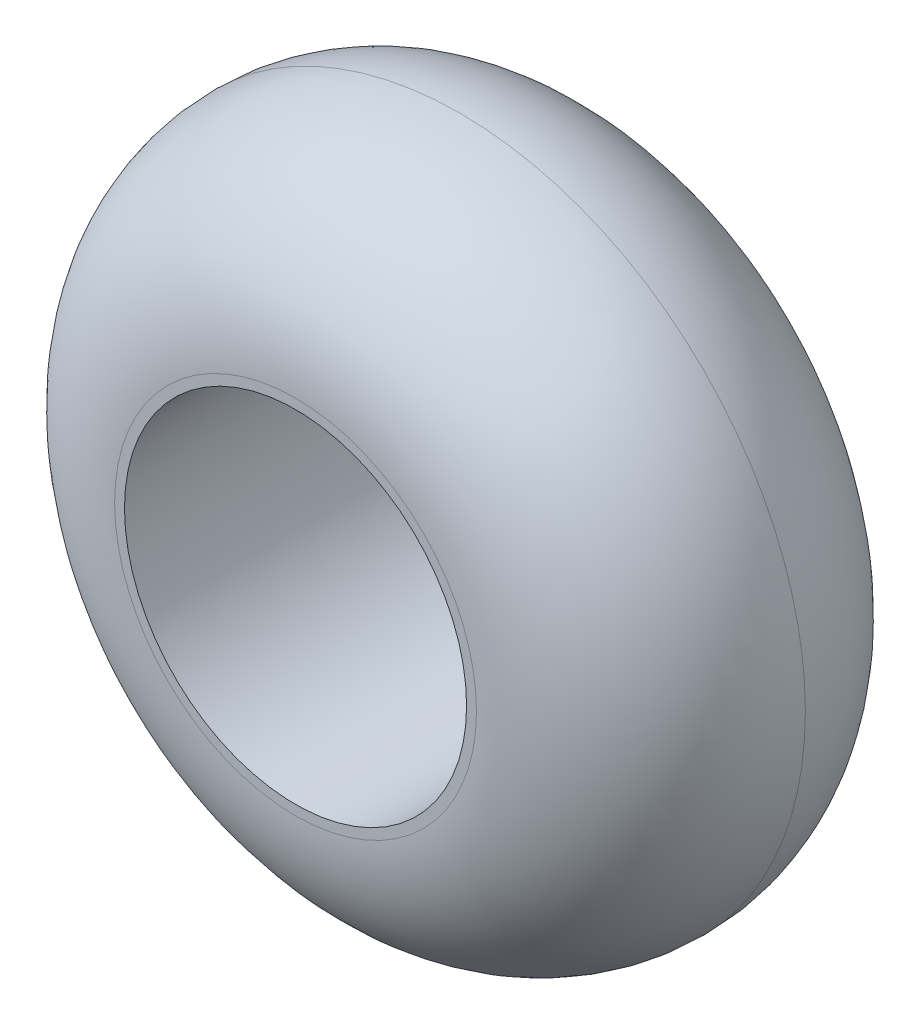
ISO-10303-21;
HEADER;
FILE_DESCRIPTION(('STEP AP214'),'2;1');
FILE_NAME('part.step','',(''),(''),'','','');
FILE_SCHEMA(('AUTOMOTIVE_DESIGN { 1 0 10303 214 1 1 1 1 }'));
ENDSEC;
DATA;
#1=APPLICATION_CONTEXT('core data for automotive mechanical design processes');
#2=APPLICATION_PROTOCOL_DEFINITION('international standard','automotive_design',2000,#1);
#3=PRODUCT_CONTEXT('',#1,'mechanical');
#4=PRODUCT('Part','Part','',(#3));
#5=PRODUCT_RELATED_PRODUCT_CATEGORY('part','',(#4));
#6=PRODUCT_DEFINITION_FORMATION('','',#4);
#7=PRODUCT_DEFINITION_CONTEXT('part definition',#1,'design');
#8=PRODUCT_DEFINITION('design','',#6,#7);
#9=PRODUCT_DEFINITION_SHAPE('','',#8);
#10=(LENGTH_UNIT() NAMED_UNIT(*) SI_UNIT(.MILLI.,.METRE.));
#11=(NAMED_UNIT(*) PLANE_ANGLE_UNIT() SI_UNIT($,.RADIAN.));
#12=(NAMED_UNIT(*) SI_UNIT($,.STERADIAN.) SOLID_ANGLE_UNIT());
#13=UNCERTAINTY_MEASURE_WITH_UNIT(LENGTH_MEASURE(1.E-05),#10,'distance_accuracy_value','');
#14=(GEOMETRIC_REPRESENTATION_CONTEXT(3) GLOBAL_UNCERTAINTY_ASSIGNED_CONTEXT((#13)) GLOBAL_UNIT_ASSIGNED_CONTEXT((#10,
#11,#12)) REPRESENTATION_CONTEXT('',''));
#15=CARTESIAN_POINT('',(0.,0.,0.));
#16=DIRECTION('',(0.,0.,1.));
#17=DIRECTION('',(1.,0.,0.));
#18=AXIS2_PLACEMENT_3D('',#15,#16,#17);
#19=CARTESIAN_POINT('',(0.,0.,5.));
#20=DIRECTION('',(0.,0.,1.));
#21=DIRECTION('',(1.,0.,0.));
#22=AXIS2_PLACEMENT_3D('',#19,#20,#21);
#23=PLANE('',#22);
#24=CARTESIAN_POINT('',(0.,0.,5.));
#25=DIRECTION('',(0.,0.,1.));
#26=DIRECTION('',(1.,0.,0.));
#27=AXIS2_PLACEMENT_3D('',#24,#25,#26);
#28=CIRCLE('',#27,2.75);
#29=CARTESIAN_POINT('',(2.75,0.,5.));
#30=VERTEX_POINT('',#29);
#31=EDGE_CURVE('E10',#30,#30,#28,.T.);
#32=ORIENTED_EDGE('',*,*,#31,.T.);
#33=EDGE_LOOP('',(#32));
#34=FACE_BOUND('',#33,.T.);
#35=CARTESIAN_POINT('',(0.,0.,5.));
#36=DIRECTION('',(0.,0.,1.));
#37=DIRECTION('',(1.,0.,0.));
#38=AXIS2_PLACEMENT_3D('',#35,#36,#37);
#39=CIRCLE('',#38,2.6);
#40=CARTESIAN_POINT('',(2.6,0.,5.));
#41=VERTEX_POINT('',#40);
#42=EDGE_CURVE('E47',#41,#41,#39,.T.);
#43=ORIENTED_EDGE('',*,*,#42,.F.);
#44=EDGE_LOOP('',(#43));
#45=FACE_BOUND('',#44,.T.);
#46=ADVANCED_FACE('F35',(#34,#45),#23,.T.);
#47=CARTESIAN_POINT('',(0.,0.,0.));
#48=DIRECTION('',(0.,0.,1.));
#49=DIRECTION('',(1.,0.,0.));
#50=AXIS2_PLACEMENT_3D('',#47,#48,#49);
#51=PLANE('',#50);
#52=CARTESIAN_POINT('',(0.,0.,0.));
#53=DIRECTION('',(0.,0.,1.));
#54=DIRECTION('',(1.,0.,0.));
#55=AXIS2_PLACEMENT_3D('',#52,#53,#54);
#56=CIRCLE('',#55,2.75);
#57=CARTESIAN_POINT('',(2.75,0.,0.));
#58=VERTEX_POINT('',#57);
#59=EDGE_CURVE('E43',#58,#58,#56,.F.);
#60=ORIENTED_EDGE('',*,*,#59,.T.);
#61=EDGE_LOOP('',(#60));
#62=FACE_BOUND('',#61,.T.);
#63=CARTESIAN_POINT('',(0.,0.,0.));
#64=DIRECTION('',(0.,0.,1.));
#65=DIRECTION('',(1.,0.,0.));
#66=AXIS2_PLACEMENT_3D('',#63,#64,#65);
#67=CIRCLE('',#66,2.6);
#68=CARTESIAN_POINT('',(2.6,0.,0.));
#69=VERTEX_POINT('',#68);
#70=EDGE_CURVE('E50',#69,#69,#67,.T.);
#71=ORIENTED_EDGE('',*,*,#70,.T.);
#72=EDGE_LOOP('',(#71));
#73=FACE_BOUND('',#72,.T.);
#74=ADVANCED_FACE('F60',(#62,#73),#51,.F.);
#75=CARTESIAN_POINT('',(0.,0.,5.));
#76=DIRECTION('',(0.,0.,-1.));
#77=DIRECTION('',(-1.,0.,0.));
#78=AXIS2_PLACEMENT_3D('',#75,#76,#77);
#79=CYLINDRICAL_SURFACE('',#78,2.6);
#80=ORIENTED_EDGE('',*,*,#42,.T.);
#81=EDGE_LOOP('',(#80));
#82=FACE_BOUND('',#81,.T.);
#83=ORIENTED_EDGE('',*,*,#70,.F.);
#84=EDGE_LOOP('',(#83));
#85=FACE_BOUND('',#84,.T.);
#86=ADVANCED_FACE('F56',(#82,#85),#79,.F.);
#87=CARTESIAN_POINT('',(0.,0.,2.5));
#88=DIRECTION('',(0.,0.,1.));
#89=DIRECTION('',(1.,0.,0.));
#90=AXIS2_PLACEMENT_3D('',#87,#88,#89);
#91=TOROIDAL_SURFACE('',#90,2.75,2.5);
#92=ORIENTED_EDGE('',*,*,#31,.F.);
#93=EDGE_LOOP('',(#92));
#94=FACE_BOUND('',#93,.T.);
#95=CARTESIAN_POINT('',(0.,0.,2.5));
#96=DIRECTION('',(0.,0.,1.));
#97=DIRECTION('',(1.,0.,0.));
#98=AXIS2_PLACEMENT_3D('',#95,#96,#97);
#99=CIRCLE('',#98,5.25);
#100=CARTESIAN_POINT('',(5.25,0.,2.5));
#101=VERTEX_POINT('',#100);
#102=EDGE_CURVE('E39',#101,#101,#99,.F.);
#103=ORIENTED_EDGE('',*,*,#102,.F.);
#104=EDGE_LOOP('',(#103));
#105=FACE_BOUND('',#104,.T.);
#106=ADVANCED_FACE('F37',(#94,#105),#91,.T.);
#107=CARTESIAN_POINT('',(0.,0.,2.5));
#108=DIRECTION('',(0.,0.,1.));
#109=DIRECTION('',(1.,0.,0.));
#110=AXIS2_PLACEMENT_3D('',#107,#108,#109);
#111=TOROIDAL_SURFACE('',#110,2.75,2.5);
#112=ORIENTED_EDGE('',*,*,#59,.F.);
#113=EDGE_LOOP('',(#112));
#114=FACE_BOUND('',#113,.T.);
#115=ORIENTED_EDGE('',*,*,#102,.T.);
#116=EDGE_LOOP('',(#115));
#117=FACE_BOUND('',#116,.T.);
#118=ADVANCED_FACE('F68',(#114,#117),#111,.T.);
#119=CLOSED_SHELL('',(#46,#74,#86,#106,#118));
#120=MANIFOLD_SOLID_BREP('B2',#119);
#121=ADVANCED_BREP_SHAPE_REPRESENTATION('',(#18,#120),#14);
#122=SHAPE_DEFINITION_REPRESENTATION(#9,#121);
ENDSEC;
END-ISO-10303-21;
